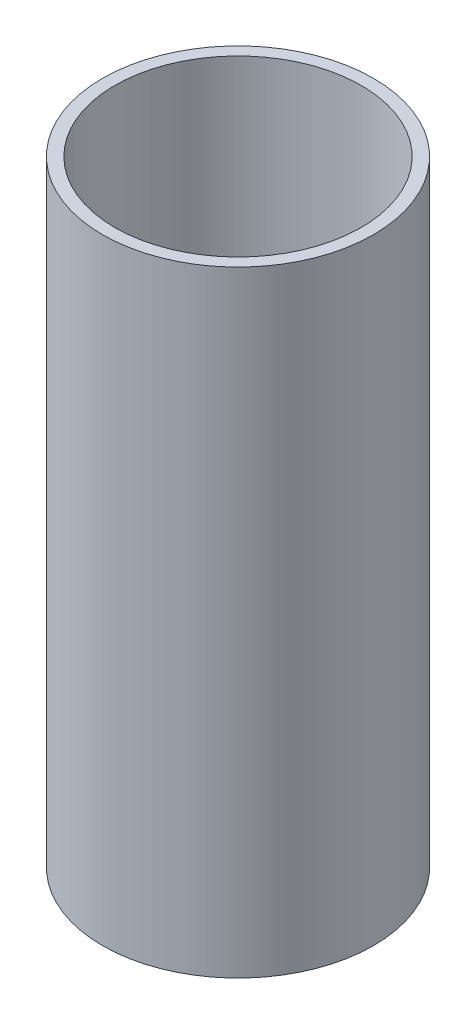
ISO-10303-21;
HEADER;
FILE_DESCRIPTION(('STEP AP214'),'2;1');
FILE_NAME('part.step','',(''),(''),'','','');
FILE_SCHEMA(('AUTOMOTIVE_DESIGN { 1 0 10303 214 1 1 1 1 }'));
ENDSEC;
DATA;
#1=APPLICATION_CONTEXT('core data for automotive mechanical design processes');
#2=APPLICATION_PROTOCOL_DEFINITION('international standard','automotive_design',2000,#1);
#3=PRODUCT_CONTEXT('',#1,'mechanical');
#4=PRODUCT('Part','Part','',(#3));
#5=PRODUCT_RELATED_PRODUCT_CATEGORY('part','',(#4));
#6=PRODUCT_DEFINITION_FORMATION('','',#4);
#7=PRODUCT_DEFINITION_CONTEXT('part definition',#1,'design');
#8=PRODUCT_DEFINITION('design','',#6,#7);
#9=PRODUCT_DEFINITION_SHAPE('','',#8);
#10=(LENGTH_UNIT() NAMED_UNIT(*) SI_UNIT(.MILLI.,.METRE.));
#11=(NAMED_UNIT(*) PLANE_ANGLE_UNIT() SI_UNIT($,.RADIAN.));
#12=(NAMED_UNIT(*) SI_UNIT($,.STERADIAN.) SOLID_ANGLE_UNIT());
#13=UNCERTAINTY_MEASURE_WITH_UNIT(LENGTH_MEASURE(1.E-05),#10,'distance_accuracy_value','');
#14=(GEOMETRIC_REPRESENTATION_CONTEXT(3) GLOBAL_UNCERTAINTY_ASSIGNED_CONTEXT((#13)) GLOBAL_UNIT_ASSIGNED_CONTEXT((#10,
#11,#12)) REPRESENTATION_CONTEXT('',''));
#15=CARTESIAN_POINT('',(0.,0.,0.));
#16=DIRECTION('',(0.,0.,1.));
#17=DIRECTION('',(1.,0.,0.));
#18=AXIS2_PLACEMENT_3D('',#15,#16,#17);
#19=CARTESIAN_POINT('',(0.,50.,0.));
#20=DIRECTION('',(0.,1.,0.));
#21=DIRECTION('',(0.,0.,1.));
#22=AXIS2_PLACEMENT_3D('',#19,#20,#21);
#23=PLANE('',#22);
#24=CARTESIAN_POINT('',(0.,50.,0.));
#25=DIRECTION('',(0.,1.,0.));
#26=DIRECTION('',(0.,0.,1.));
#27=AXIS2_PLACEMENT_3D('',#24,#25,#26);
#28=CIRCLE('',#27,11.);
#29=CARTESIAN_POINT('',(0.,50.,11.));
#30=VERTEX_POINT('',#29);
#31=EDGE_CURVE('E10',#30,#30,#28,.T.);
#32=ORIENTED_EDGE('',*,*,#31,.T.);
#33=EDGE_LOOP('',(#32));
#34=FACE_BOUND('',#33,.T.);
#35=CARTESIAN_POINT('',(0.,50.,0.));
#36=DIRECTION('',(0.,1.,0.));
#37=DIRECTION('',(0.,0.,1.));
#38=AXIS2_PLACEMENT_3D('',#35,#36,#37);
#39=CIRCLE('',#38,10.);
#40=CARTESIAN_POINT('',(0.,50.,10.));
#41=VERTEX_POINT('',#40);
#42=EDGE_CURVE('E41',#41,#41,#39,.T.);
#43=ORIENTED_EDGE('',*,*,#42,.F.);
#44=EDGE_LOOP('',(#43));
#45=FACE_BOUND('',#44,.T.);
#46=ADVANCED_FACE('F30',(#34,#45),#23,.T.);
#47=CARTESIAN_POINT('',(0.,0.,0.));
#48=DIRECTION('',(0.,1.,0.));
#49=DIRECTION('',(0.,0.,1.));
#50=AXIS2_PLACEMENT_3D('',#47,#48,#49);
#51=PLANE('',#50);
#52=CARTESIAN_POINT('',(0.,0.,0.));
#53=DIRECTION('',(0.,1.,0.));
#54=DIRECTION('',(0.,0.,1.));
#55=AXIS2_PLACEMENT_3D('',#52,#53,#54);
#56=CIRCLE('',#55,11.);
#57=CARTESIAN_POINT('',(0.,0.,11.));
#58=VERTEX_POINT('',#57);
#59=EDGE_CURVE('E34',#58,#58,#56,.T.);
#60=ORIENTED_EDGE('',*,*,#59,.F.);
#61=EDGE_LOOP('',(#60));
#62=FACE_BOUND('',#61,.T.);
#63=CARTESIAN_POINT('',(0.,0.,0.));
#64=DIRECTION('',(0.,1.,0.));
#65=DIRECTION('',(0.,0.,1.));
#66=AXIS2_PLACEMENT_3D('',#63,#64,#65);
#67=CIRCLE('',#66,10.);
#68=CARTESIAN_POINT('',(0.,0.,10.));
#69=VERTEX_POINT('',#68);
#70=EDGE_CURVE('E43',#69,#69,#67,.T.);
#71=ORIENTED_EDGE('',*,*,#70,.T.);
#72=EDGE_LOOP('',(#71));
#73=FACE_BOUND('',#72,.T.);
#74=ADVANCED_FACE('F53',(#62,#73),#51,.F.);
#75=CARTESIAN_POINT('',(0.,50.,0.));
#76=DIRECTION('',(0.,-1.,0.));
#77=DIRECTION('',(0.,0.,-1.));
#78=AXIS2_PLACEMENT_3D('',#75,#76,#77);
#79=CYLINDRICAL_SURFACE('',#78,11.);
#80=ORIENTED_EDGE('',*,*,#31,.F.);
#81=EDGE_LOOP('',(#80));
#82=FACE_BOUND('',#81,.T.);
#83=ORIENTED_EDGE('',*,*,#59,.T.);
#84=EDGE_LOOP('',(#83));
#85=FACE_BOUND('',#84,.T.);
#86=ADVANCED_FACE('F32',(#82,#85),#79,.T.);
#87=CARTESIAN_POINT('',(0.,50.,0.));
#88=DIRECTION('',(0.,-1.,0.));
#89=DIRECTION('',(0.,0.,-1.));
#90=AXIS2_PLACEMENT_3D('',#87,#88,#89);
#91=CYLINDRICAL_SURFACE('',#90,10.);
#92=ORIENTED_EDGE('',*,*,#42,.T.);
#93=EDGE_LOOP('',(#92));
#94=FACE_BOUND('',#93,.T.);
#95=ORIENTED_EDGE('',*,*,#70,.F.);
#96=EDGE_LOOP('',(#95));
#97=FACE_BOUND('',#96,.T.);
#98=ADVANCED_FACE('F49',(#94,#97),#91,.F.);
#99=CLOSED_SHELL('',(#46,#74,#86,#98));
#100=MANIFOLD_SOLID_BREP('B2',#99);
#101=ADVANCED_BREP_SHAPE_REPRESENTATION('',(#18,#100),#14);
#102=SHAPE_DEFINITION_REPRESENTATION(#9,#101);
ENDSEC;
END-ISO-10303-21;
